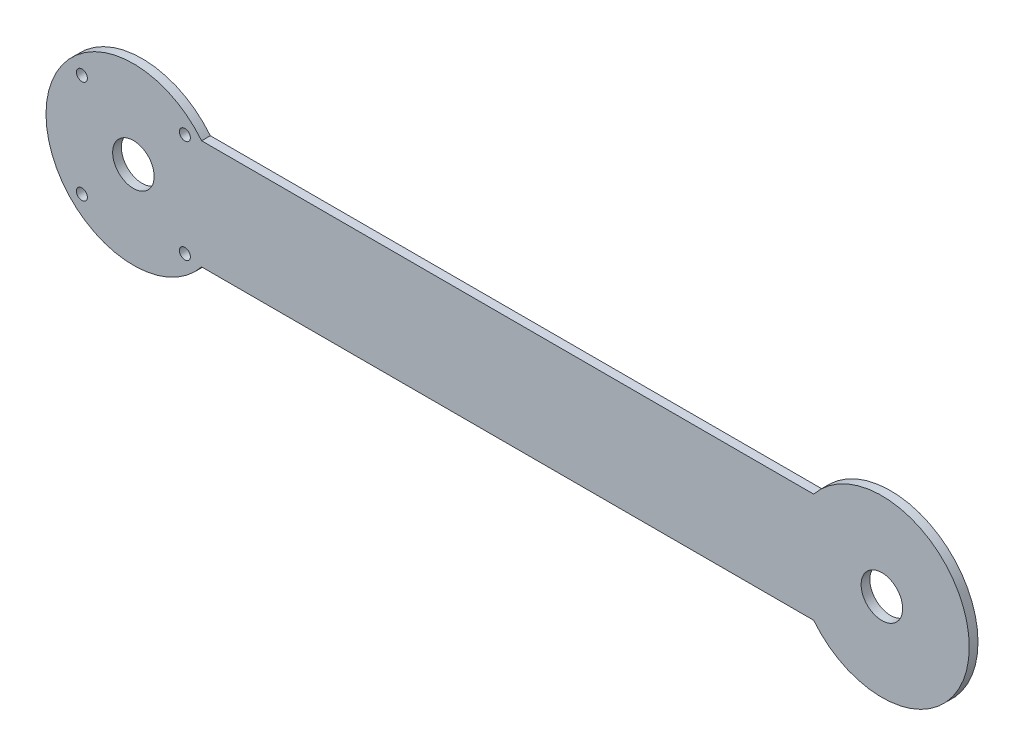
ISO-10303-21;
HEADER;
FILE_DESCRIPTION(('STEP AP214'),'2;1');
FILE_NAME('part.step','',(''),(''),'','','');
FILE_SCHEMA(('AUTOMOTIVE_DESIGN { 1 0 10303 214 1 1 1 1 }'));
ENDSEC;
DATA;
#1=APPLICATION_CONTEXT('core data for automotive mechanical design processes');
#2=APPLICATION_PROTOCOL_DEFINITION('international standard','automotive_design',2000,#1);
#3=PRODUCT_CONTEXT('',#1,'mechanical');
#4=PRODUCT('Part','Part','',(#3));
#5=PRODUCT_RELATED_PRODUCT_CATEGORY('part','',(#4));
#6=PRODUCT_DEFINITION_FORMATION('','',#4);
#7=PRODUCT_DEFINITION_CONTEXT('part definition',#1,'design');
#8=PRODUCT_DEFINITION('design','',#6,#7);
#9=PRODUCT_DEFINITION_SHAPE('','',#8);
#10=(LENGTH_UNIT() NAMED_UNIT(*) SI_UNIT(.MILLI.,.METRE.));
#11=(NAMED_UNIT(*) PLANE_ANGLE_UNIT() SI_UNIT($,.RADIAN.));
#12=(NAMED_UNIT(*) SI_UNIT($,.STERADIAN.) SOLID_ANGLE_UNIT());
#13=UNCERTAINTY_MEASURE_WITH_UNIT(LENGTH_MEASURE(1.E-05),#10,'distance_accuracy_value','');
#14=(GEOMETRIC_REPRESENTATION_CONTEXT(3) GLOBAL_UNCERTAINTY_ASSIGNED_CONTEXT((#13)) GLOBAL_UNIT_ASSIGNED_CONTEXT((#10,
#11,#12)) REPRESENTATION_CONTEXT('',''));
#15=CARTESIAN_POINT('',(0.,0.,0.));
#16=DIRECTION('',(0.,0.,1.));
#17=DIRECTION('',(1.,0.,0.));
#18=AXIS2_PLACEMENT_3D('',#15,#16,#17);
#19=CARTESIAN_POINT('',(0.,0.,4.));
#20=DIRECTION('',(0.,0.,1.));
#21=DIRECTION('',(1.,0.,0.));
#22=AXIS2_PLACEMENT_3D('',#19,#20,#21);
#23=PLANE('',#22);
#24=CARTESIAN_POINT('',(342.566188985847,-1.38666811331198E-13,4.));
#25=DIRECTION('',(0.,0.,1.));
#26=DIRECTION('',(1.,0.,0.));
#27=AXIS2_PLACEMENT_3D('',#24,#25,#26);
#28=CIRCLE('',#27,9.50000000000001);
#29=CARTESIAN_POINT('',(352.066188985847,-1.38666811331198E-13,4.));
#30=VERTEX_POINT('',#29);
#31=EDGE_CURVE('E158',#30,#30,#28,.T.);
#32=ORIENTED_EDGE('',*,*,#31,.F.);
#33=EDGE_LOOP('',(#32));
#34=FACE_BOUND('',#33,.T.);
#35=CARTESIAN_POINT('',(23.5700000000013,-23.5699999999987,4.));
#36=DIRECTION('',(0.,0.,1.));
#37=DIRECTION('',(1.,0.,0.));
#38=AXIS2_PLACEMENT_3D('',#35,#36,#37);
#39=CIRCLE('',#38,2.50000000000187);
#40=CARTESIAN_POINT('',(26.0700000000032,-23.5699999999987,4.));
#41=VERTEX_POINT('',#40);
#42=EDGE_CURVE('E142',#41,#41,#39,.T.);
#43=ORIENTED_EDGE('',*,*,#42,.F.);
#44=EDGE_LOOP('',(#43));
#45=FACE_BOUND('',#44,.T.);
#46=CARTESIAN_POINT('',(-23.57,23.57,4.));
#47=DIRECTION('',(0.,0.,1.));
#48=DIRECTION('',(1.,0.,0.));
#49=AXIS2_PLACEMENT_3D('',#46,#47,#48);
#50=CIRCLE('',#49,2.5);
#51=CARTESIAN_POINT('',(-21.07,23.57,4.));
#52=VERTEX_POINT('',#51);
#53=EDGE_CURVE('E112',#52,#52,#50,.T.);
#54=ORIENTED_EDGE('',*,*,#53,.F.);
#55=EDGE_LOOP('',(#54));
#56=FACE_BOUND('',#55,.T.);
#57=CARTESIAN_POINT('',(0.,0.,4.));
#58=DIRECTION('',(0.,0.,1.));
#59=DIRECTION('',(1.,0.,0.));
#60=AXIS2_PLACEMENT_3D('',#57,#58,#59);
#61=CIRCLE('',#60,40.);
#62=CARTESIAN_POINT('',(31.224989991992,25.,4.));
#63=VERTEX_POINT('',#62);
#64=CARTESIAN_POINT('',(31.224989991992,-25.,4.));
#65=VERTEX_POINT('',#64);
#66=EDGE_CURVE('E92',#63,#65,#61,.T.);
#67=ORIENTED_EDGE('',*,*,#66,.T.);
#68=DIRECTION('',(1.,0.,0.));
#69=VECTOR('',#68,1.);
#70=CARTESIAN_POINT('',(31.224989991992,-25.,4.));
#71=LINE('',#70,#69);
#72=CARTESIAN_POINT('',(311.341198993855,-25.,4.));
#73=VERTEX_POINT('',#72);
#74=EDGE_CURVE('E87',#65,#73,#71,.T.);
#75=ORIENTED_EDGE('',*,*,#74,.T.);
#76=CARTESIAN_POINT('',(342.566188985847,-1.38666811331198E-13,4.));
#77=DIRECTION('',(0.,0.,1.));
#78=DIRECTION('',(-1.,0.,0.));
#79=AXIS2_PLACEMENT_3D('',#76,#77,#78);
#80=CIRCLE('',#79,40.);
#81=CARTESIAN_POINT('',(311.341198993855,25.,4.));
#82=VERTEX_POINT('',#81);
#83=EDGE_CURVE('E90',#73,#82,#80,.T.);
#84=ORIENTED_EDGE('',*,*,#83,.T.);
#85=DIRECTION('',(-1.,0.,0.));
#86=VECTOR('',#85,1.);
#87=CARTESIAN_POINT('',(31.224989991992,25.,4.));
#88=LINE('',#87,#86);
#89=EDGE_CURVE('E57',#82,#63,#88,.T.);
#90=ORIENTED_EDGE('',*,*,#89,.T.);
#91=EDGE_LOOP('',(#67,#75,#84,#90));
#92=FACE_BOUND('',#91,.T.);
#93=CARTESIAN_POINT('',(23.57,23.5700000000013,4.));
#94=DIRECTION('',(0.,0.,1.));
#95=DIRECTION('',(1.,0.,0.));
#96=AXIS2_PLACEMENT_3D('',#93,#94,#95);
#97=CIRCLE('',#96,2.50000000000138);
#98=CARTESIAN_POINT('',(26.0700000000014,23.5700000000013,4.));
#99=VERTEX_POINT('',#98);
#100=EDGE_CURVE('E134',#99,#99,#97,.T.);
#101=ORIENTED_EDGE('',*,*,#100,.F.);
#102=EDGE_LOOP('',(#101));
#103=FACE_BOUND('',#102,.T.);
#104=CARTESIAN_POINT('',(-23.5699999999987,-23.57,4.));
#105=DIRECTION('',(0.,0.,1.));
#106=DIRECTION('',(1.,0.,0.));
#107=AXIS2_PLACEMENT_3D('',#104,#105,#106);
#108=CIRCLE('',#107,2.50000000000071);
#109=CARTESIAN_POINT('',(-21.069999999998,-23.57,4.));
#110=VERTEX_POINT('',#109);
#111=EDGE_CURVE('E150',#110,#110,#108,.T.);
#112=ORIENTED_EDGE('',*,*,#111,.F.);
#113=EDGE_LOOP('',(#112));
#114=FACE_BOUND('',#113,.T.);
#115=CARTESIAN_POINT('',(0.,0.,4.));
#116=DIRECTION('',(0.,0.,1.));
#117=DIRECTION('',(1.,0.,0.));
#118=AXIS2_PLACEMENT_3D('',#115,#116,#117);
#119=CIRCLE('',#118,9.5);
#120=CARTESIAN_POINT('',(9.5,0.,4.));
#121=VERTEX_POINT('',#120);
#122=EDGE_CURVE('E166',#121,#121,#119,.T.);
#123=ORIENTED_EDGE('',*,*,#122,.F.);
#124=EDGE_LOOP('',(#123));
#125=FACE_BOUND('',#124,.T.);
#126=ADVANCED_FACE('F39',(#34,#45,#56,#92,#103,#114,#125),#23,.T.);
#127=CARTESIAN_POINT('',(0.,0.,0.));
#128=DIRECTION('',(0.,0.,1.));
#129=DIRECTION('',(1.,0.,0.));
#130=AXIS2_PLACEMENT_3D('',#127,#128,#129);
#131=PLANE('',#130);
#132=CARTESIAN_POINT('',(0.,0.,0.));
#133=DIRECTION('',(0.,0.,1.));
#134=DIRECTION('',(1.,0.,0.));
#135=AXIS2_PLACEMENT_3D('',#132,#133,#134);
#136=CIRCLE('',#135,40.);
#137=CARTESIAN_POINT('',(31.224989991992,25.,0.));
#138=VERTEX_POINT('',#137);
#139=CARTESIAN_POINT('',(31.224989991992,-25.,0.));
#140=VERTEX_POINT('',#139);
#141=EDGE_CURVE('E108',#138,#140,#136,.T.);
#142=ORIENTED_EDGE('',*,*,#141,.F.);
#143=DIRECTION('',(-1.,0.,0.));
#144=VECTOR('',#143,1.);
#145=CARTESIAN_POINT('',(31.224989991992,25.,0.));
#146=LINE('',#145,#144);
#147=CARTESIAN_POINT('',(311.341198993855,25.,0.));
#148=VERTEX_POINT('',#147);
#149=EDGE_CURVE('E80',#148,#138,#146,.T.);
#150=ORIENTED_EDGE('',*,*,#149,.F.);
#151=CARTESIAN_POINT('',(342.566188985847,-1.38666811331198E-13,0.));
#152=DIRECTION('',(0.,0.,1.));
#153=DIRECTION('',(-1.,0.,0.));
#154=AXIS2_PLACEMENT_3D('',#151,#152,#153);
#155=CIRCLE('',#154,40.);
#156=CARTESIAN_POINT('',(311.341198993855,-25.,0.));
#157=VERTEX_POINT('',#156);
#158=EDGE_CURVE('E74',#157,#148,#155,.T.);
#159=ORIENTED_EDGE('',*,*,#158,.F.);
#160=DIRECTION('',(1.,0.,0.));
#161=VECTOR('',#160,1.);
#162=CARTESIAN_POINT('',(31.224989991992,-25.,0.));
#163=LINE('',#162,#161);
#164=EDGE_CURVE('E97',#140,#157,#163,.T.);
#165=ORIENTED_EDGE('',*,*,#164,.F.);
#166=EDGE_LOOP('',(#142,#150,#159,#165));
#167=FACE_BOUND('',#166,.T.);
#168=CARTESIAN_POINT('',(-23.57,23.57,0.));
#169=DIRECTION('',(0.,0.,1.));
#170=DIRECTION('',(1.,0.,0.));
#171=AXIS2_PLACEMENT_3D('',#168,#169,#170);
#172=CIRCLE('',#171,2.5);
#173=CARTESIAN_POINT('',(-21.07,23.57,0.));
#174=VERTEX_POINT('',#173);
#175=EDGE_CURVE('E130',#174,#174,#172,.T.);
#176=ORIENTED_EDGE('',*,*,#175,.T.);
#177=EDGE_LOOP('',(#176));
#178=FACE_BOUND('',#177,.T.);
#179=CARTESIAN_POINT('',(23.57,23.5700000000013,0.));
#180=DIRECTION('',(0.,0.,1.));
#181=DIRECTION('',(1.,0.,0.));
#182=AXIS2_PLACEMENT_3D('',#179,#180,#181);
#183=CIRCLE('',#182,2.50000000000138);
#184=CARTESIAN_POINT('',(26.0700000000014,23.5700000000013,0.));
#185=VERTEX_POINT('',#184);
#186=EDGE_CURVE('E138',#185,#185,#183,.T.);
#187=ORIENTED_EDGE('',*,*,#186,.T.);
#188=EDGE_LOOP('',(#187));
#189=FACE_BOUND('',#188,.T.);
#190=CARTESIAN_POINT('',(23.5700000000013,-23.5699999999987,0.));
#191=DIRECTION('',(0.,0.,1.));
#192=DIRECTION('',(1.,0.,0.));
#193=AXIS2_PLACEMENT_3D('',#190,#191,#192);
#194=CIRCLE('',#193,2.50000000000187);
#195=CARTESIAN_POINT('',(26.0700000000032,-23.5699999999987,0.));
#196=VERTEX_POINT('',#195);
#197=EDGE_CURVE('E146',#196,#196,#194,.T.);
#198=ORIENTED_EDGE('',*,*,#197,.T.);
#199=EDGE_LOOP('',(#198));
#200=FACE_BOUND('',#199,.T.);
#201=CARTESIAN_POINT('',(-23.5699999999987,-23.57,0.));
#202=DIRECTION('',(0.,0.,1.));
#203=DIRECTION('',(1.,0.,0.));
#204=AXIS2_PLACEMENT_3D('',#201,#202,#203);
#205=CIRCLE('',#204,2.50000000000071);
#206=CARTESIAN_POINT('',(-21.069999999998,-23.57,0.));
#207=VERTEX_POINT('',#206);
#208=EDGE_CURVE('E154',#207,#207,#205,.T.);
#209=ORIENTED_EDGE('',*,*,#208,.T.);
#210=EDGE_LOOP('',(#209));
#211=FACE_BOUND('',#210,.T.);
#212=CARTESIAN_POINT('',(342.566188985847,-1.38666811331198E-13,0.));
#213=DIRECTION('',(0.,0.,1.));
#214=DIRECTION('',(1.,0.,0.));
#215=AXIS2_PLACEMENT_3D('',#212,#213,#214);
#216=CIRCLE('',#215,9.50000000000001);
#217=CARTESIAN_POINT('',(352.066188985847,-1.38666811331198E-13,0.));
#218=VERTEX_POINT('',#217);
#219=EDGE_CURVE('E162',#218,#218,#216,.T.);
#220=ORIENTED_EDGE('',*,*,#219,.T.);
#221=EDGE_LOOP('',(#220));
#222=FACE_BOUND('',#221,.T.);
#223=CARTESIAN_POINT('',(0.,0.,0.));
#224=DIRECTION('',(0.,0.,1.));
#225=DIRECTION('',(1.,0.,0.));
#226=AXIS2_PLACEMENT_3D('',#223,#224,#225);
#227=CIRCLE('',#226,9.5);
#228=CARTESIAN_POINT('',(9.5,0.,0.));
#229=VERTEX_POINT('',#228);
#230=EDGE_CURVE('E170',#229,#229,#227,.T.);
#231=ORIENTED_EDGE('',*,*,#230,.T.);
#232=EDGE_LOOP('',(#231));
#233=FACE_BOUND('',#232,.T.);
#234=ADVANCED_FACE('F125',(#167,#178,#189,#200,#211,#222,#233),#131,.F.);
#235=CARTESIAN_POINT('',(0.,0.,4.));
#236=DIRECTION('',(0.,0.,-1.));
#237=DIRECTION('',(-1.,0.,0.));
#238=AXIS2_PLACEMENT_3D('',#235,#236,#237);
#239=CYLINDRICAL_SURFACE('',#238,40.);
#240=ORIENTED_EDGE('',*,*,#141,.T.);
#241=DIRECTION('',(0.,0.,-1.));
#242=VECTOR('',#241,1.);
#243=CARTESIAN_POINT('',(31.224989991992,-25.,4.));
#244=LINE('',#243,#242);
#245=EDGE_CURVE('E11',#65,#140,#244,.T.);
#246=ORIENTED_EDGE('',*,*,#245,.F.);
#247=ORIENTED_EDGE('',*,*,#66,.F.);
#248=DIRECTION('',(0.,0.,-1.));
#249=VECTOR('',#248,1.);
#250=CARTESIAN_POINT('',(31.224989991992,25.,4.));
#251=LINE('',#250,#249);
#252=EDGE_CURVE('E104',#63,#138,#251,.T.);
#253=ORIENTED_EDGE('',*,*,#252,.T.);
#254=EDGE_LOOP('',(#240,#246,#247,#253));
#255=FACE_BOUND('',#254,.T.);
#256=ADVANCED_FACE('F41',(#255),#239,.T.);
#257=CARTESIAN_POINT('',(31.224989991992,-25.,4.));
#258=DIRECTION('',(0.,1.,0.));
#259=DIRECTION('',(0.,0.,1.));
#260=AXIS2_PLACEMENT_3D('',#257,#258,#259);
#261=PLANE('',#260);
#262=ORIENTED_EDGE('',*,*,#164,.T.);
#263=DIRECTION('',(0.,0.,-1.));
#264=VECTOR('',#263,1.);
#265=CARTESIAN_POINT('',(311.341198993855,-25.,4.));
#266=LINE('',#265,#264);
#267=EDGE_CURVE('E49',#73,#157,#266,.T.);
#268=ORIENTED_EDGE('',*,*,#267,.F.);
#269=ORIENTED_EDGE('',*,*,#74,.F.);
#270=ORIENTED_EDGE('',*,*,#245,.T.);
#271=EDGE_LOOP('',(#262,#268,#269,#270));
#272=FACE_BOUND('',#271,.T.);
#273=ADVANCED_FACE('F96',(#272),#261,.F.);
#274=CARTESIAN_POINT('',(342.566188985847,-1.38666811331198E-13,4.));
#275=DIRECTION('',(0.,0.,-1.));
#276=DIRECTION('',(-1.,0.,0.));
#277=AXIS2_PLACEMENT_3D('',#274,#275,#276);
#278=CYLINDRICAL_SURFACE('',#277,40.);
#279=ORIENTED_EDGE('',*,*,#158,.T.);
#280=DIRECTION('',(0.,0.,-1.));
#281=VECTOR('',#280,1.);
#282=CARTESIAN_POINT('',(311.341198993855,25.,4.));
#283=LINE('',#282,#281);
#284=EDGE_CURVE('E99',#82,#148,#283,.T.);
#285=ORIENTED_EDGE('',*,*,#284,.F.);
#286=ORIENTED_EDGE('',*,*,#83,.F.);
#287=ORIENTED_EDGE('',*,*,#267,.T.);
#288=EDGE_LOOP('',(#279,#285,#286,#287));
#289=FACE_BOUND('',#288,.T.);
#290=ADVANCED_FACE('F100',(#289),#278,.T.);
#291=CARTESIAN_POINT('',(31.224989991992,25.,4.));
#292=DIRECTION('',(0.,-1.,0.));
#293=DIRECTION('',(0.,0.,-1.));
#294=AXIS2_PLACEMENT_3D('',#291,#292,#293);
#295=PLANE('',#294);
#296=ORIENTED_EDGE('',*,*,#149,.T.);
#297=ORIENTED_EDGE('',*,*,#252,.F.);
#298=ORIENTED_EDGE('',*,*,#89,.F.);
#299=ORIENTED_EDGE('',*,*,#284,.T.);
#300=EDGE_LOOP('',(#296,#297,#298,#299));
#301=FACE_BOUND('',#300,.T.);
#302=ADVANCED_FACE('F122',(#301),#295,.F.);
#303=CARTESIAN_POINT('',(-23.57,23.57,4.));
#304=DIRECTION('',(0.,0.,-1.));
#305=DIRECTION('',(-1.,0.,0.));
#306=AXIS2_PLACEMENT_3D('',#303,#304,#305);
#307=CYLINDRICAL_SURFACE('',#306,2.5);
#308=ORIENTED_EDGE('',*,*,#53,.T.);
#309=EDGE_LOOP('',(#308));
#310=FACE_BOUND('',#309,.T.);
#311=ORIENTED_EDGE('',*,*,#175,.F.);
#312=EDGE_LOOP('',(#311));
#313=FACE_BOUND('',#312,.T.);
#314=ADVANCED_FACE('F191',(#310,#313),#307,.F.);
#315=CARTESIAN_POINT('',(23.57,23.5700000000013,4.));
#316=DIRECTION('',(0.,0.,-1.));
#317=DIRECTION('',(-1.,0.,0.));
#318=AXIS2_PLACEMENT_3D('',#315,#316,#317);
#319=CYLINDRICAL_SURFACE('',#318,2.50000000000138);
#320=ORIENTED_EDGE('',*,*,#100,.T.);
#321=EDGE_LOOP('',(#320));
#322=FACE_BOUND('',#321,.T.);
#323=ORIENTED_EDGE('',*,*,#186,.F.);
#324=EDGE_LOOP('',(#323));
#325=FACE_BOUND('',#324,.T.);
#326=ADVANCED_FACE('F237',(#322,#325),#319,.F.);
#327=CARTESIAN_POINT('',(23.5700000000013,-23.5699999999987,4.));
#328=DIRECTION('',(0.,0.,-1.));
#329=DIRECTION('',(-1.,0.,0.));
#330=AXIS2_PLACEMENT_3D('',#327,#328,#329);
#331=CYLINDRICAL_SURFACE('',#330,2.50000000000187);
#332=ORIENTED_EDGE('',*,*,#42,.T.);
#333=EDGE_LOOP('',(#332));
#334=FACE_BOUND('',#333,.T.);
#335=ORIENTED_EDGE('',*,*,#197,.F.);
#336=EDGE_LOOP('',(#335));
#337=FACE_BOUND('',#336,.T.);
#338=ADVANCED_FACE('F245',(#334,#337),#331,.F.);
#339=CARTESIAN_POINT('',(-23.5699999999987,-23.57,4.));
#340=DIRECTION('',(0.,0.,-1.));
#341=DIRECTION('',(-1.,0.,0.));
#342=AXIS2_PLACEMENT_3D('',#339,#340,#341);
#343=CYLINDRICAL_SURFACE('',#342,2.50000000000071);
#344=ORIENTED_EDGE('',*,*,#111,.T.);
#345=EDGE_LOOP('',(#344));
#346=FACE_BOUND('',#345,.T.);
#347=ORIENTED_EDGE('',*,*,#208,.F.);
#348=EDGE_LOOP('',(#347));
#349=FACE_BOUND('',#348,.T.);
#350=ADVANCED_FACE('F253',(#346,#349),#343,.F.);
#351=CARTESIAN_POINT('',(342.566188985847,-1.38666811331198E-13,4.));
#352=DIRECTION('',(0.,0.,-1.));
#353=DIRECTION('',(-1.,0.,0.));
#354=AXIS2_PLACEMENT_3D('',#351,#352,#353);
#355=CYLINDRICAL_SURFACE('',#354,9.50000000000001);
#356=ORIENTED_EDGE('',*,*,#31,.T.);
#357=EDGE_LOOP('',(#356));
#358=FACE_BOUND('',#357,.T.);
#359=ORIENTED_EDGE('',*,*,#219,.F.);
#360=EDGE_LOOP('',(#359));
#361=FACE_BOUND('',#360,.T.);
#362=ADVANCED_FACE('F262',(#358,#361),#355,.F.);
#363=CARTESIAN_POINT('',(0.,0.,4.));
#364=DIRECTION('',(0.,0.,-1.));
#365=DIRECTION('',(-1.,0.,0.));
#366=AXIS2_PLACEMENT_3D('',#363,#364,#365);
#367=CYLINDRICAL_SURFACE('',#366,9.5);
#368=ORIENTED_EDGE('',*,*,#122,.T.);
#369=EDGE_LOOP('',(#368));
#370=FACE_BOUND('',#369,.T.);
#371=ORIENTED_EDGE('',*,*,#230,.F.);
#372=EDGE_LOOP('',(#371));
#373=FACE_BOUND('',#372,.T.);
#374=ADVANCED_FACE('F178',(#370,#373),#367,.F.);
#375=CLOSED_SHELL('',(#126,#234,#256,#273,#290,#302,#314,#326,#338,#350,#362,#374));
#376=MANIFOLD_SOLID_BREP('B2',#375);
#377=ADVANCED_BREP_SHAPE_REPRESENTATION('',(#18,#376),#14);
#378=SHAPE_DEFINITION_REPRESENTATION(#9,#377);
ENDSEC;
END-ISO-10303-21;
